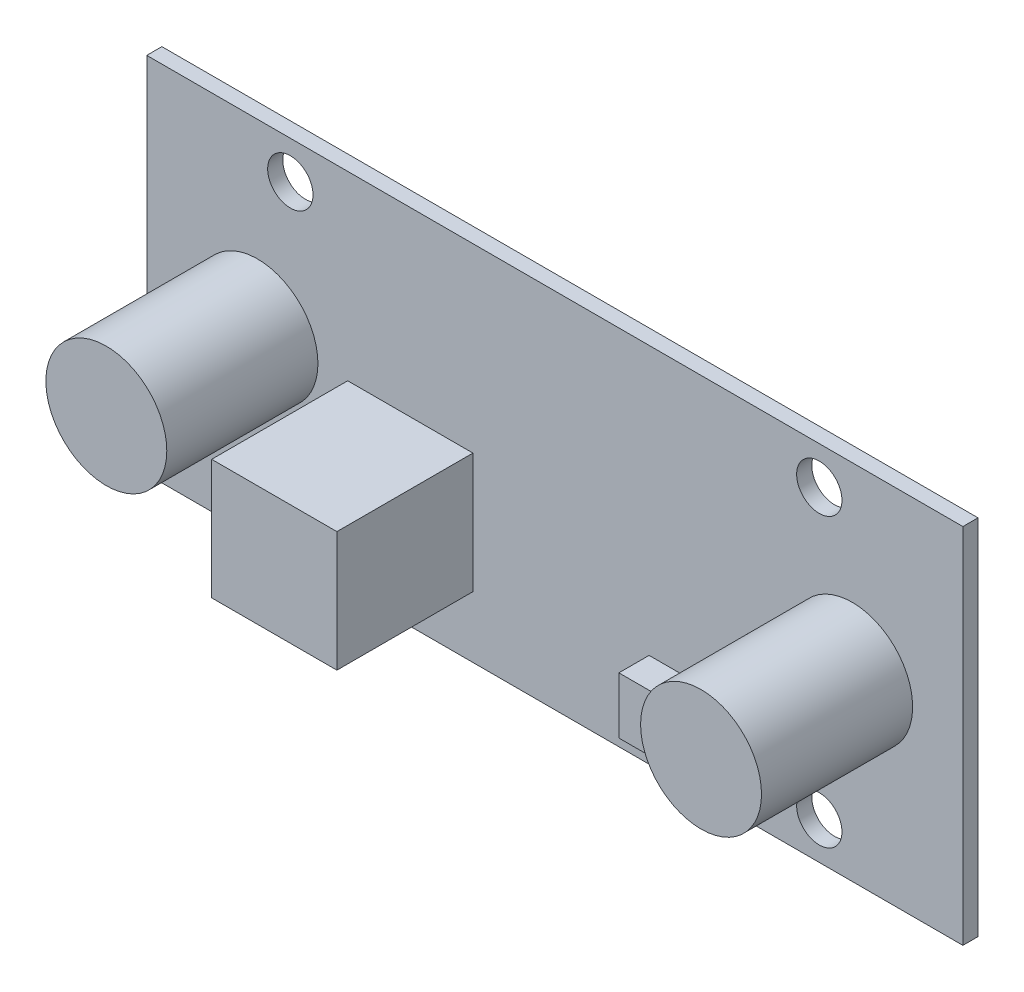
ISO-10303-21;
HEADER;
FILE_DESCRIPTION(('STEP AP214'),'2;1');
FILE_NAME('part.step','',(''),(''),'','','');
FILE_SCHEMA(('AUTOMOTIVE_DESIGN { 1 0 10303 214 1 1 1 1 }'));
ENDSEC;
DATA;
#1=APPLICATION_CONTEXT('core data for automotive mechanical design processes');
#2=APPLICATION_PROTOCOL_DEFINITION('international standard','automotive_design',2000,#1);
#3=PRODUCT_CONTEXT('',#1,'mechanical');
#4=PRODUCT('Part','Part','',(#3));
#5=PRODUCT_RELATED_PRODUCT_CATEGORY('part','',(#4));
#6=PRODUCT_DEFINITION_FORMATION('','',#4);
#7=PRODUCT_DEFINITION_CONTEXT('part definition',#1,'design');
#8=PRODUCT_DEFINITION('design','',#6,#7);
#9=PRODUCT_DEFINITION_SHAPE('','',#8);
#10=(LENGTH_UNIT() NAMED_UNIT(*) SI_UNIT(.MILLI.,.METRE.));
#11=(NAMED_UNIT(*) PLANE_ANGLE_UNIT() SI_UNIT($,.RADIAN.));
#12=(NAMED_UNIT(*) SI_UNIT($,.STERADIAN.) SOLID_ANGLE_UNIT());
#13=UNCERTAINTY_MEASURE_WITH_UNIT(LENGTH_MEASURE(1.E-05),#10,'distance_accuracy_value','');
#14=(GEOMETRIC_REPRESENTATION_CONTEXT(3) GLOBAL_UNCERTAINTY_ASSIGNED_CONTEXT((#13)) GLOBAL_UNIT_ASSIGNED_CONTEXT((#10,
#11,#12)) REPRESENTATION_CONTEXT('',''));
#15=CARTESIAN_POINT('',(0.,0.,0.));
#16=DIRECTION('',(0.,0.,1.));
#17=DIRECTION('',(1.,0.,0.));
#18=AXIS2_PLACEMENT_3D('',#15,#16,#17);
#19=CARTESIAN_POINT('',(0.,0.,1.));
#20=DIRECTION('',(0.,0.,-1.));
#21=DIRECTION('',(-1.,0.,0.));
#22=AXIS2_PLACEMENT_3D('',#19,#20,#21);
#23=PLANE('',#22);
#24=CARTESIAN_POINT('',(46.6749933578082,12.,1.));
#25=DIRECTION('',(0.,0.,1.));
#26=DIRECTION('',(-1.,0.,0.));
#27=AXIS2_PLACEMENT_3D('',#24,#25,#26);
#28=CIRCLE('',#27,4.00000000000001);
#29=CARTESIAN_POINT('',(42.6749933578082,12.,1.));
#30=VERTEX_POINT('',#29);
#31=EDGE_CURVE('E197',#30,#30,#28,.T.);
#32=ORIENTED_EDGE('',*,*,#31,.F.);
#33=EDGE_LOOP('',(#32));
#34=FACE_BOUND('',#33,.T.);
#35=CARTESIAN_POINT('',(7.32500664219177,12.,1.));
#36=DIRECTION('',(0.,0.,1.));
#37=DIRECTION('',(1.,0.,0.));
#38=AXIS2_PLACEMENT_3D('',#35,#36,#37);
#39=CIRCLE('',#38,4.);
#40=CARTESIAN_POINT('',(11.3250066421918,12.,1.));
#41=VERTEX_POINT('',#40);
#42=EDGE_CURVE('E200',#41,#41,#39,.T.);
#43=ORIENTED_EDGE('',*,*,#42,.F.);
#44=EDGE_LOOP('',(#43));
#45=FACE_BOUND('',#44,.T.);
#46=CARTESIAN_POINT('',(44.5,21.5,1.));
#47=DIRECTION('',(0.,0.,1.));
#48=DIRECTION('',(-1.,0.,0.));
#49=AXIS2_PLACEMENT_3D('',#46,#47,#48);
#50=CIRCLE('',#49,1.5);
#51=CARTESIAN_POINT('',(43.,21.5,1.));
#52=VERTEX_POINT('',#51);
#53=EDGE_CURVE('E204',#52,#52,#50,.T.);
#54=ORIENTED_EDGE('',*,*,#53,.F.);
#55=EDGE_LOOP('',(#54));
#56=FACE_BOUND('',#55,.T.);
#57=CARTESIAN_POINT('',(44.5,2.5,1.));
#58=DIRECTION('',(0.,0.,1.));
#59=DIRECTION('',(-1.,0.,0.));
#60=AXIS2_PLACEMENT_3D('',#57,#58,#59);
#61=CIRCLE('',#60,1.5);
#62=CARTESIAN_POINT('',(43.,2.5,1.));
#63=VERTEX_POINT('',#62);
#64=EDGE_CURVE('E210',#63,#63,#61,.T.);
#65=ORIENTED_EDGE('',*,*,#64,.F.);
#66=EDGE_LOOP('',(#65));
#67=FACE_BOUND('',#66,.T.);
#68=CARTESIAN_POINT('',(9.5,2.5,1.));
#69=DIRECTION('',(0.,0.,1.));
#70=DIRECTION('',(1.,0.,0.));
#71=AXIS2_PLACEMENT_3D('',#68,#69,#70);
#72=CIRCLE('',#71,1.5);
#73=CARTESIAN_POINT('',(11.,2.5,1.));
#74=VERTEX_POINT('',#73);
#75=EDGE_CURVE('E216',#74,#74,#72,.T.);
#76=ORIENTED_EDGE('',*,*,#75,.F.);
#77=EDGE_LOOP('',(#76));
#78=FACE_BOUND('',#77,.T.);
#79=CARTESIAN_POINT('',(9.5,21.5,1.));
#80=DIRECTION('',(0.,0.,1.));
#81=DIRECTION('',(1.,0.,0.));
#82=AXIS2_PLACEMENT_3D('',#79,#80,#81);
#83=CIRCLE('',#82,1.5);
#84=CARTESIAN_POINT('',(11.,21.5,1.));
#85=VERTEX_POINT('',#84);
#86=EDGE_CURVE('E222',#85,#85,#83,.T.);
#87=ORIENTED_EDGE('',*,*,#86,.F.);
#88=EDGE_LOOP('',(#87));
#89=FACE_BOUND('',#88,.T.);
#90=DIRECTION('',(0.,-1.,0.));
#91=VECTOR('',#90,1.);
#92=CARTESIAN_POINT('',(33.2378520436596,6.23616003888983,1.));
#93=LINE('',#92,#91);
#94=CARTESIAN_POINT('',(33.2378520436596,6.23616003888983,1.));
#95=VERTEX_POINT('',#94);
#96=CARTESIAN_POINT('',(33.2378520436596,2.5,1.));
#97=VERTEX_POINT('',#96);
#98=EDGE_CURVE('E225',#95,#97,#93,.T.);
#99=ORIENTED_EDGE('',*,*,#98,.F.);
#100=DIRECTION('',(-1.,0.,0.));
#101=VECTOR('',#100,1.);
#102=CARTESIAN_POINT('',(33.2378520436596,6.23616003888983,1.));
#103=LINE('',#102,#101);
#104=CARTESIAN_POINT('',(39.9091808055552,6.23616003888983,1.));
#105=VERTEX_POINT('',#104);
#106=EDGE_CURVE('E62',#105,#95,#103,.T.);
#107=ORIENTED_EDGE('',*,*,#106,.F.);
#108=DIRECTION('',(0.,1.,0.));
#109=VECTOR('',#108,1.);
#110=CARTESIAN_POINT('',(39.9091808055552,6.23616003888983,1.));
#111=LINE('',#110,#109);
#112=CARTESIAN_POINT('',(39.9091808055552,2.5,1.));
#113=VERTEX_POINT('',#112);
#114=EDGE_CURVE('E133',#113,#105,#111,.T.);
#115=ORIENTED_EDGE('',*,*,#114,.F.);
#116=DIRECTION('',(1.,0.,0.));
#117=VECTOR('',#116,1.);
#118=CARTESIAN_POINT('',(33.2378520436596,2.5,1.));
#119=LINE('',#118,#117);
#120=EDGE_CURVE('E230',#97,#113,#119,.T.);
#121=ORIENTED_EDGE('',*,*,#120,.F.);
#122=EDGE_LOOP('',(#99,#107,#115,#121));
#123=FACE_BOUND('',#122,.T.);
#124=DIRECTION('',(0.,-1.,0.));
#125=VECTOR('',#124,1.);
#126=CARTESIAN_POINT('',(0.,0.,1.));
#127=LINE('',#126,#125);
#128=CARTESIAN_POINT('',(0.,24.,1.));
#129=VERTEX_POINT('',#128);
#130=CARTESIAN_POINT('',(0.,0.,1.));
#131=VERTEX_POINT('',#130);
#132=EDGE_CURVE('E236',#129,#131,#127,.T.);
#133=ORIENTED_EDGE('',*,*,#132,.T.);
#134=DIRECTION('',(1.,0.,0.));
#135=VECTOR('',#134,1.);
#136=CARTESIAN_POINT('',(0.,0.,1.));
#137=LINE('',#136,#135);
#138=CARTESIAN_POINT('',(54.,0.,1.));
#139=VERTEX_POINT('',#138);
#140=EDGE_CURVE('E239',#131,#139,#137,.T.);
#141=ORIENTED_EDGE('',*,*,#140,.T.);
#142=DIRECTION('',(0.,1.,0.));
#143=VECTOR('',#142,1.);
#144=CARTESIAN_POINT('',(54.,0.,1.));
#145=LINE('',#144,#143);
#146=CARTESIAN_POINT('',(54.,24.,1.));
#147=VERTEX_POINT('',#146);
#148=EDGE_CURVE('E242',#139,#147,#145,.T.);
#149=ORIENTED_EDGE('',*,*,#148,.T.);
#150=DIRECTION('',(-1.,0.,0.));
#151=VECTOR('',#150,1.);
#152=CARTESIAN_POINT('',(0.,24.,1.));
#153=LINE('',#152,#151);
#154=EDGE_CURVE('E244',#147,#129,#153,.T.);
#155=ORIENTED_EDGE('',*,*,#154,.T.);
#156=EDGE_LOOP('',(#133,#141,#149,#155));
#157=FACE_BOUND('',#156,.T.);
#158=DIRECTION('',(0.,-1.,0.));
#159=VECTOR('',#158,1.);
#160=CARTESIAN_POINT('',(13.2940902712562,12.,1.));
#161=LINE('',#160,#159);
#162=CARTESIAN_POINT('',(13.2940902712562,12.,1.));
#163=VERTEX_POINT('',#162);
#164=CARTESIAN_POINT('',(13.2940902712562,4.05920012711339,1.));
#165=VERTEX_POINT('',#164);
#166=EDGE_CURVE('E188',#163,#165,#161,.T.);
#167=ORIENTED_EDGE('',*,*,#166,.F.);
#168=DIRECTION('',(-1.,0.,0.));
#169=VECTOR('',#168,1.);
#170=CARTESIAN_POINT('',(13.2940902712562,12.,1.));
#171=LINE('',#170,#169);
#172=CARTESIAN_POINT('',(21.5805828386633,12.,1.));
#173=VERTEX_POINT('',#172);
#174=EDGE_CURVE('E54',#173,#163,#171,.T.);
#175=ORIENTED_EDGE('',*,*,#174,.F.);
#176=DIRECTION('',(0.,1.,0.));
#177=VECTOR('',#176,1.);
#178=CARTESIAN_POINT('',(21.5805828386633,12.,1.));
#179=LINE('',#178,#177);
#180=CARTESIAN_POINT('',(21.5805828386633,4.05920012711339,0.999999999999999));
#181=VERTEX_POINT('',#180);
#182=EDGE_CURVE('E194',#181,#173,#179,.T.);
#183=ORIENTED_EDGE('',*,*,#182,.F.);
#184=DIRECTION('',(1.,0.,0.));
#185=VECTOR('',#184,1.);
#186=CARTESIAN_POINT('',(13.2940902712562,4.05920012711339,1.));
#187=LINE('',#186,#185);
#188=EDGE_CURVE('E191',#165,#181,#187,.T.);
#189=ORIENTED_EDGE('',*,*,#188,.F.);
#190=EDGE_LOOP('',(#167,#175,#183,#189));
#191=FACE_BOUND('',#190,.T.);
#192=ADVANCED_FACE('F39',(#34,#45,#56,#67,#78,#89,#123,#157,#191),#23,.F.);
#193=CARTESIAN_POINT('',(0.,0.,0.));
#194=DIRECTION('',(0.,0.,-1.));
#195=DIRECTION('',(-1.,0.,0.));
#196=AXIS2_PLACEMENT_3D('',#193,#194,#195);
#197=PLANE('',#196);
#198=CARTESIAN_POINT('',(44.5,2.5,0.));
#199=DIRECTION('',(0.,0.,1.));
#200=DIRECTION('',(-1.,0.,0.));
#201=AXIS2_PLACEMENT_3D('',#198,#199,#200);
#202=CIRCLE('',#201,1.5);
#203=CARTESIAN_POINT('',(43.,2.5,0.));
#204=VERTEX_POINT('',#203);
#205=EDGE_CURVE('E207',#204,#204,#202,.T.);
#206=ORIENTED_EDGE('',*,*,#205,.T.);
#207=EDGE_LOOP('',(#206));
#208=FACE_BOUND('',#207,.T.);
#209=CARTESIAN_POINT('',(9.5,21.5,0.));
#210=DIRECTION('',(0.,0.,1.));
#211=DIRECTION('',(1.,0.,0.));
#212=AXIS2_PLACEMENT_3D('',#209,#210,#211);
#213=CIRCLE('',#212,1.5);
#214=CARTESIAN_POINT('',(11.,21.5,0.));
#215=VERTEX_POINT('',#214);
#216=EDGE_CURVE('E219',#215,#215,#213,.T.);
#217=ORIENTED_EDGE('',*,*,#216,.T.);
#218=EDGE_LOOP('',(#217));
#219=FACE_BOUND('',#218,.T.);
#220=DIRECTION('',(0.,-1.,0.));
#221=VECTOR('',#220,1.);
#222=CARTESIAN_POINT('',(0.,0.,0.));
#223=LINE('',#222,#221);
#224=CARTESIAN_POINT('',(0.,24.,0.));
#225=VERTEX_POINT('',#224);
#226=CARTESIAN_POINT('',(0.,0.,0.));
#227=VERTEX_POINT('',#226);
#228=EDGE_CURVE('E235',#225,#227,#223,.T.);
#229=ORIENTED_EDGE('',*,*,#228,.F.);
#230=DIRECTION('',(-1.,0.,0.));
#231=VECTOR('',#230,1.);
#232=CARTESIAN_POINT('',(0.,24.,0.));
#233=LINE('',#232,#231);
#234=CARTESIAN_POINT('',(54.,24.,0.));
#235=VERTEX_POINT('',#234);
#236=EDGE_CURVE('E240',#235,#225,#233,.T.);
#237=ORIENTED_EDGE('',*,*,#236,.F.);
#238=DIRECTION('',(0.,1.,0.));
#239=VECTOR('',#238,1.);
#240=CARTESIAN_POINT('',(54.,0.,0.));
#241=LINE('',#240,#239);
#242=CARTESIAN_POINT('',(54.,0.,0.));
#243=VERTEX_POINT('',#242);
#244=EDGE_CURVE('E251',#243,#235,#241,.T.);
#245=ORIENTED_EDGE('',*,*,#244,.F.);
#246=DIRECTION('',(1.,0.,0.));
#247=VECTOR('',#246,1.);
#248=CARTESIAN_POINT('',(0.,0.,0.));
#249=LINE('',#248,#247);
#250=EDGE_CURVE('E249',#227,#243,#249,.T.);
#251=ORIENTED_EDGE('',*,*,#250,.F.);
#252=EDGE_LOOP('',(#229,#237,#245,#251));
#253=FACE_BOUND('',#252,.T.);
#254=CARTESIAN_POINT('',(9.5,2.5,0.));
#255=DIRECTION('',(0.,0.,1.));
#256=DIRECTION('',(1.,0.,0.));
#257=AXIS2_PLACEMENT_3D('',#254,#255,#256);
#258=CIRCLE('',#257,1.5);
#259=CARTESIAN_POINT('',(11.,2.5,0.));
#260=VERTEX_POINT('',#259);
#261=EDGE_CURVE('E213',#260,#260,#258,.T.);
#262=ORIENTED_EDGE('',*,*,#261,.T.);
#263=EDGE_LOOP('',(#262));
#264=FACE_BOUND('',#263,.T.);
#265=CARTESIAN_POINT('',(44.5,21.5,0.));
#266=DIRECTION('',(0.,0.,1.));
#267=DIRECTION('',(-1.,0.,0.));
#268=AXIS2_PLACEMENT_3D('',#265,#266,#267);
#269=CIRCLE('',#268,1.5);
#270=CARTESIAN_POINT('',(43.,21.5,0.));
#271=VERTEX_POINT('',#270);
#272=EDGE_CURVE('E203',#271,#271,#269,.T.);
#273=ORIENTED_EDGE('',*,*,#272,.T.);
#274=EDGE_LOOP('',(#273));
#275=FACE_BOUND('',#274,.T.);
#276=ADVANCED_FACE('F269',(#208,#219,#253,#264,#275),#197,.T.);
#277=CARTESIAN_POINT('',(0.,0.,1.));
#278=DIRECTION('',(1.,0.,0.));
#279=DIRECTION('',(0.,0.,-1.));
#280=AXIS2_PLACEMENT_3D('',#277,#278,#279);
#281=PLANE('',#280);
#282=ORIENTED_EDGE('',*,*,#228,.T.);
#283=DIRECTION('',(0.,0.,-1.));
#284=VECTOR('',#283,1.);
#285=CARTESIAN_POINT('',(0.,0.,1.));
#286=LINE('',#285,#284);
#287=EDGE_CURVE('E11',#131,#227,#286,.T.);
#288=ORIENTED_EDGE('',*,*,#287,.F.);
#289=ORIENTED_EDGE('',*,*,#132,.F.);
#290=DIRECTION('',(0.,0.,-1.));
#291=VECTOR('',#290,1.);
#292=CARTESIAN_POINT('',(0.,24.,1.));
#293=LINE('',#292,#291);
#294=EDGE_CURVE('E246',#129,#225,#293,.T.);
#295=ORIENTED_EDGE('',*,*,#294,.T.);
#296=EDGE_LOOP('',(#282,#288,#289,#295));
#297=FACE_BOUND('',#296,.T.);
#298=ADVANCED_FACE('F41',(#297),#281,.F.);
#299=CARTESIAN_POINT('',(0.,0.,1.));
#300=DIRECTION('',(0.,1.,0.));
#301=DIRECTION('',(0.,0.,1.));
#302=AXIS2_PLACEMENT_3D('',#299,#300,#301);
#303=PLANE('',#302);
#304=ORIENTED_EDGE('',*,*,#250,.T.);
#305=DIRECTION('',(0.,0.,-1.));
#306=VECTOR('',#305,1.);
#307=CARTESIAN_POINT('',(54.,0.,1.));
#308=LINE('',#307,#306);
#309=EDGE_CURVE('E47',#139,#243,#308,.T.);
#310=ORIENTED_EDGE('',*,*,#309,.F.);
#311=ORIENTED_EDGE('',*,*,#140,.F.);
#312=ORIENTED_EDGE('',*,*,#287,.T.);
#313=EDGE_LOOP('',(#304,#310,#311,#312));
#314=FACE_BOUND('',#313,.T.);
#315=ADVANCED_FACE('F279',(#314),#303,.F.);
#316=CARTESIAN_POINT('',(54.,0.,1.));
#317=DIRECTION('',(-1.,0.,0.));
#318=DIRECTION('',(0.,0.,1.));
#319=AXIS2_PLACEMENT_3D('',#316,#317,#318);
#320=PLANE('',#319);
#321=ORIENTED_EDGE('',*,*,#244,.T.);
#322=DIRECTION('',(0.,0.,-1.));
#323=VECTOR('',#322,1.);
#324=CARTESIAN_POINT('',(54.,24.,1.));
#325=LINE('',#324,#323);
#326=EDGE_CURVE('E256',#147,#235,#325,.T.);
#327=ORIENTED_EDGE('',*,*,#326,.F.);
#328=ORIENTED_EDGE('',*,*,#148,.F.);
#329=ORIENTED_EDGE('',*,*,#309,.T.);
#330=EDGE_LOOP('',(#321,#327,#328,#329));
#331=FACE_BOUND('',#330,.T.);
#332=ADVANCED_FACE('F263',(#331),#320,.F.);
#333=CARTESIAN_POINT('',(0.,24.,1.));
#334=DIRECTION('',(0.,-1.,0.));
#335=DIRECTION('',(0.,0.,-1.));
#336=AXIS2_PLACEMENT_3D('',#333,#334,#335);
#337=PLANE('',#336);
#338=ORIENTED_EDGE('',*,*,#236,.T.);
#339=ORIENTED_EDGE('',*,*,#294,.F.);
#340=ORIENTED_EDGE('',*,*,#154,.F.);
#341=ORIENTED_EDGE('',*,*,#326,.T.);
#342=EDGE_LOOP('',(#338,#339,#340,#341));
#343=FACE_BOUND('',#342,.T.);
#344=ADVANCED_FACE('F273',(#343),#337,.F.);
#345=CARTESIAN_POINT('',(9.5,21.5,1.));
#346=DIRECTION('',(0.,0.,-1.));
#347=DIRECTION('',(-1.,0.,0.));
#348=AXIS2_PLACEMENT_3D('',#345,#346,#347);
#349=CYLINDRICAL_SURFACE('',#348,1.5);
#350=ORIENTED_EDGE('',*,*,#86,.T.);
#351=EDGE_LOOP('',(#350));
#352=FACE_BOUND('',#351,.T.);
#353=ORIENTED_EDGE('',*,*,#216,.F.);
#354=EDGE_LOOP('',(#353));
#355=FACE_BOUND('',#354,.T.);
#356=ADVANCED_FACE('F297',(#352,#355),#349,.F.);
#357=CARTESIAN_POINT('',(9.5,2.5,1.));
#358=DIRECTION('',(0.,0.,-1.));
#359=DIRECTION('',(-1.,0.,0.));
#360=AXIS2_PLACEMENT_3D('',#357,#358,#359);
#361=CYLINDRICAL_SURFACE('',#360,1.5);
#362=ORIENTED_EDGE('',*,*,#75,.T.);
#363=EDGE_LOOP('',(#362));
#364=FACE_BOUND('',#363,.T.);
#365=ORIENTED_EDGE('',*,*,#261,.F.);
#366=EDGE_LOOP('',(#365));
#367=FACE_BOUND('',#366,.T.);
#368=ADVANCED_FACE('F304',(#364,#367),#361,.F.);
#369=CARTESIAN_POINT('',(44.5,2.5,1.));
#370=DIRECTION('',(0.,0.,-1.));
#371=DIRECTION('',(-1.,0.,0.));
#372=AXIS2_PLACEMENT_3D('',#369,#370,#371);
#373=CYLINDRICAL_SURFACE('',#372,1.5);
#374=ORIENTED_EDGE('',*,*,#64,.T.);
#375=EDGE_LOOP('',(#374));
#376=FACE_BOUND('',#375,.T.);
#377=ORIENTED_EDGE('',*,*,#205,.F.);
#378=EDGE_LOOP('',(#377));
#379=FACE_BOUND('',#378,.T.);
#380=ADVANCED_FACE('F309',(#376,#379),#373,.F.);
#381=CARTESIAN_POINT('',(44.5,21.5,1.));
#382=DIRECTION('',(0.,0.,-1.));
#383=DIRECTION('',(-1.,0.,0.));
#384=AXIS2_PLACEMENT_3D('',#381,#382,#383);
#385=CYLINDRICAL_SURFACE('',#384,1.5);
#386=ORIENTED_EDGE('',*,*,#53,.T.);
#387=EDGE_LOOP('',(#386));
#388=FACE_BOUND('',#387,.T.);
#389=ORIENTED_EDGE('',*,*,#272,.F.);
#390=EDGE_LOOP('',(#389));
#391=FACE_BOUND('',#390,.T.);
#392=ADVANCED_FACE('F368',(#388,#391),#385,.F.);
#393=CARTESIAN_POINT('',(7.32500664219177,12.,11.));
#394=DIRECTION('',(0.,0.,-1.));
#395=DIRECTION('',(-1.,0.,0.));
#396=AXIS2_PLACEMENT_3D('',#393,#394,#395);
#397=CYLINDRICAL_SURFACE('',#396,4.);
#398=CARTESIAN_POINT('',(7.32500664219177,12.,11.));
#399=DIRECTION('',(0.,0.,1.));
#400=DIRECTION('',(1.,0.,0.));
#401=AXIS2_PLACEMENT_3D('',#398,#399,#400);
#402=CIRCLE('',#401,4.);
#403=CARTESIAN_POINT('',(11.3250066421918,12.,11.));
#404=VERTEX_POINT('',#403);
#405=EDGE_CURVE('E185',#404,#404,#402,.T.);
#406=ORIENTED_EDGE('',*,*,#405,.F.);
#407=EDGE_LOOP('',(#406));
#408=FACE_BOUND('',#407,.T.);
#409=ORIENTED_EDGE('',*,*,#42,.T.);
#410=EDGE_LOOP('',(#409));
#411=FACE_BOUND('',#410,.T.);
#412=ADVANCED_FACE('F364',(#408,#411),#397,.T.);
#413=CARTESIAN_POINT('',(0.,0.,11.));
#414=DIRECTION('',(0.,0.,1.));
#415=DIRECTION('',(1.,0.,0.));
#416=AXIS2_PLACEMENT_3D('',#413,#414,#415);
#417=PLANE('',#416);
#418=ORIENTED_EDGE('',*,*,#405,.T.);
#419=EDGE_LOOP('',(#418));
#420=FACE_BOUND('',#419,.T.);
#421=ADVANCED_FACE('F360',(#420),#417,.T.);
#422=CARTESIAN_POINT('',(46.6749933578082,12.,11.));
#423=DIRECTION('',(0.,0.,-1.));
#424=DIRECTION('',(-1.,0.,0.));
#425=AXIS2_PLACEMENT_3D('',#422,#423,#424);
#426=CYLINDRICAL_SURFACE('',#425,4.00000000000001);
#427=CARTESIAN_POINT('',(46.6749933578082,12.,11.));
#428=DIRECTION('',(0.,0.,1.));
#429=DIRECTION('',(1.,0.,0.));
#430=AXIS2_PLACEMENT_3D('',#427,#428,#429);
#431=CIRCLE('',#430,4.00000000000001);
#432=CARTESIAN_POINT('',(50.6749933578082,12.,11.));
#433=VERTEX_POINT('',#432);
#434=EDGE_CURVE('E182',#433,#433,#431,.F.);
#435=ORIENTED_EDGE('',*,*,#434,.T.);
#436=EDGE_LOOP('',(#435));
#437=FACE_BOUND('',#436,.T.);
#438=ORIENTED_EDGE('',*,*,#31,.T.);
#439=EDGE_LOOP('',(#438));
#440=FACE_BOUND('',#439,.T.);
#441=ADVANCED_FACE('F356',(#437,#440),#426,.T.);
#442=CARTESIAN_POINT('',(0.,0.,11.));
#443=DIRECTION('',(0.,0.,1.));
#444=DIRECTION('',(1.,0.,0.));
#445=AXIS2_PLACEMENT_3D('',#442,#443,#444);
#446=PLANE('',#445);
#447=ORIENTED_EDGE('',*,*,#434,.F.);
#448=EDGE_LOOP('',(#447));
#449=FACE_BOUND('',#448,.T.);
#450=ADVANCED_FACE('F349',(#449),#446,.T.);
#451=CARTESIAN_POINT('',(0.,12.,10.));
#452=DIRECTION('',(0.,1.,0.));
#453=DIRECTION('',(0.,0.,1.));
#454=AXIS2_PLACEMENT_3D('',#451,#452,#453);
#455=PLANE('',#454);
#456=ORIENTED_EDGE('',*,*,#174,.T.);
#457=DIRECTION('',(0.,0.,-1.));
#458=VECTOR('',#457,1.);
#459=CARTESIAN_POINT('',(13.2940902712562,12.,10.));
#460=LINE('',#459,#458);
#461=CARTESIAN_POINT('',(13.2940902712562,12.,10.));
#462=VERTEX_POINT('',#461);
#463=EDGE_CURVE('E176',#462,#163,#460,.T.);
#464=ORIENTED_EDGE('',*,*,#463,.F.);
#465=DIRECTION('',(1.,0.,0.));
#466=VECTOR('',#465,1.);
#467=CARTESIAN_POINT('',(0.,12.,10.));
#468=LINE('',#467,#466);
#469=CARTESIAN_POINT('',(21.5805828386633,12.,10.));
#470=VERTEX_POINT('',#469);
#471=EDGE_CURVE('E163',#462,#470,#468,.T.);
#472=ORIENTED_EDGE('',*,*,#471,.T.);
#473=DIRECTION('',(0.,0.,-1.));
#474=VECTOR('',#473,1.);
#475=CARTESIAN_POINT('',(21.5805828386633,12.,10.));
#476=LINE('',#475,#474);
#477=EDGE_CURVE('E179',#470,#173,#476,.T.);
#478=ORIENTED_EDGE('',*,*,#477,.T.);
#479=EDGE_LOOP('',(#456,#464,#472,#478));
#480=FACE_BOUND('',#479,.T.);
#481=ADVANCED_FACE('F342',(#480),#455,.T.);
#482=CARTESIAN_POINT('',(0.,4.05920012711339,10.));
#483=DIRECTION('',(0.,1.,0.));
#484=DIRECTION('',(0.,0.,1.));
#485=AXIS2_PLACEMENT_3D('',#482,#483,#484);
#486=PLANE('',#485);
#487=DIRECTION('',(0.,0.,-1.));
#488=VECTOR('',#487,1.);
#489=CARTESIAN_POINT('',(13.2940902712562,4.05920012711339,10.));
#490=LINE('',#489,#488);
#491=CARTESIAN_POINT('',(13.2940902712562,4.05920012711339,10.));
#492=VERTEX_POINT('',#491);
#493=EDGE_CURVE('E173',#492,#165,#490,.T.);
#494=ORIENTED_EDGE('',*,*,#493,.T.);
#495=ORIENTED_EDGE('',*,*,#188,.T.);
#496=DIRECTION('',(0.,0.,-1.));
#497=VECTOR('',#496,1.);
#498=CARTESIAN_POINT('',(21.5805828386633,4.05920012711339,10.));
#499=LINE('',#498,#497);
#500=CARTESIAN_POINT('',(21.5805828386633,4.05920012711339,10.));
#501=VERTEX_POINT('',#500);
#502=EDGE_CURVE('E170',#501,#181,#499,.T.);
#503=ORIENTED_EDGE('',*,*,#502,.F.);
#504=DIRECTION('',(1.,0.,0.));
#505=VECTOR('',#504,1.);
#506=CARTESIAN_POINT('',(0.,4.05920012711339,10.));
#507=LINE('',#506,#505);
#508=EDGE_CURVE('E168',#492,#501,#507,.T.);
#509=ORIENTED_EDGE('',*,*,#508,.F.);
#510=EDGE_LOOP('',(#494,#495,#503,#509));
#511=FACE_BOUND('',#510,.T.);
#512=ADVANCED_FACE('F338',(#511),#486,.F.);
#513=CARTESIAN_POINT('',(21.5805828386633,0.,10.));
#514=DIRECTION('',(1.,0.,0.));
#515=DIRECTION('',(0.,0.,-1.));
#516=AXIS2_PLACEMENT_3D('',#513,#514,#515);
#517=PLANE('',#516);
#518=ORIENTED_EDGE('',*,*,#182,.T.);
#519=ORIENTED_EDGE('',*,*,#477,.F.);
#520=DIRECTION('',(0.,-1.,0.));
#521=VECTOR('',#520,1.);
#522=CARTESIAN_POINT('',(21.5805828386633,0.,10.));
#523=LINE('',#522,#521);
#524=EDGE_CURVE('E136',#470,#501,#523,.T.);
#525=ORIENTED_EDGE('',*,*,#524,.T.);
#526=ORIENTED_EDGE('',*,*,#502,.T.);
#527=EDGE_LOOP('',(#518,#519,#525,#526));
#528=FACE_BOUND('',#527,.T.);
#529=ADVANCED_FACE('F341',(#528),#517,.T.);
#530=CARTESIAN_POINT('',(13.2940902712562,0.,10.));
#531=DIRECTION('',(1.,0.,0.));
#532=DIRECTION('',(0.,0.,-1.));
#533=AXIS2_PLACEMENT_3D('',#530,#531,#532);
#534=PLANE('',#533);
#535=ORIENTED_EDGE('',*,*,#463,.T.);
#536=ORIENTED_EDGE('',*,*,#166,.T.);
#537=ORIENTED_EDGE('',*,*,#493,.F.);
#538=DIRECTION('',(0.,-1.,0.));
#539=VECTOR('',#538,1.);
#540=CARTESIAN_POINT('',(13.2940902712562,0.,10.));
#541=LINE('',#540,#539);
#542=EDGE_CURVE('E166',#462,#492,#541,.T.);
#543=ORIENTED_EDGE('',*,*,#542,.F.);
#544=EDGE_LOOP('',(#535,#536,#537,#543));
#545=FACE_BOUND('',#544,.T.);
#546=ADVANCED_FACE('F336',(#545),#534,.F.);
#547=CARTESIAN_POINT('',(0.,0.,10.));
#548=DIRECTION('',(0.,0.,1.));
#549=DIRECTION('',(1.,0.,0.));
#550=AXIS2_PLACEMENT_3D('',#547,#548,#549);
#551=PLANE('',#550);
#552=ORIENTED_EDGE('',*,*,#524,.F.);
#553=ORIENTED_EDGE('',*,*,#471,.F.);
#554=ORIENTED_EDGE('',*,*,#542,.T.);
#555=ORIENTED_EDGE('',*,*,#508,.T.);
#556=EDGE_LOOP('',(#552,#553,#554,#555));
#557=FACE_BOUND('',#556,.T.);
#558=ADVANCED_FACE('F328',(#557),#551,.T.);
#559=CARTESIAN_POINT('',(0.,6.23616003888983,3.));
#560=DIRECTION('',(0.,1.,0.));
#561=DIRECTION('',(0.,0.,1.));
#562=AXIS2_PLACEMENT_3D('',#559,#560,#561);
#563=PLANE('',#562);
#564=ORIENTED_EDGE('',*,*,#106,.T.);
#565=DIRECTION('',(0.,0.,-1.));
#566=VECTOR('',#565,1.);
#567=CARTESIAN_POINT('',(33.2378520436596,6.23616003888983,3.));
#568=LINE('',#567,#566);
#569=CARTESIAN_POINT('',(33.2378520436596,6.23616003888983,3.));
#570=VERTEX_POINT('',#569);
#571=EDGE_CURVE('E137',#570,#95,#568,.T.);
#572=ORIENTED_EDGE('',*,*,#571,.F.);
#573=DIRECTION('',(1.,0.,0.));
#574=VECTOR('',#573,1.);
#575=CARTESIAN_POINT('',(0.,6.23616003888983,3.));
#576=LINE('',#575,#574);
#577=CARTESIAN_POINT('',(39.9091808055552,6.23616003888983,3.));
#578=VERTEX_POINT('',#577);
#579=EDGE_CURVE('E142',#570,#578,#576,.T.);
#580=ORIENTED_EDGE('',*,*,#579,.T.);
#581=DIRECTION('',(0.,0.,-1.));
#582=VECTOR('',#581,1.);
#583=CARTESIAN_POINT('',(39.9091808055552,6.23616003888983,3.));
#584=LINE('',#583,#582);
#585=EDGE_CURVE('E128',#578,#105,#584,.T.);
#586=ORIENTED_EDGE('',*,*,#585,.T.);
#587=EDGE_LOOP('',(#564,#572,#580,#586));
#588=FACE_BOUND('',#587,.T.);
#589=ADVANCED_FACE('F147',(#588),#563,.T.);
#590=CARTESIAN_POINT('',(0.,2.5,3.));
#591=DIRECTION('',(0.,1.,0.));
#592=DIRECTION('',(0.,0.,1.));
#593=AXIS2_PLACEMENT_3D('',#590,#591,#592);
#594=PLANE('',#593);
#595=DIRECTION('',(0.,0.,-1.));
#596=VECTOR('',#595,1.);
#597=CARTESIAN_POINT('',(33.2378520436596,2.5,3.));
#598=LINE('',#597,#596);
#599=CARTESIAN_POINT('',(33.2378520436596,2.5,3.));
#600=VERTEX_POINT('',#599);
#601=EDGE_CURVE('E157',#600,#97,#598,.T.);
#602=ORIENTED_EDGE('',*,*,#601,.T.);
#603=ORIENTED_EDGE('',*,*,#120,.T.);
#604=DIRECTION('',(0.,0.,-1.));
#605=VECTOR('',#604,1.);
#606=CARTESIAN_POINT('',(39.9091808055552,2.5,3.));
#607=LINE('',#606,#605);
#608=CARTESIAN_POINT('',(39.9091808055552,2.5,3.));
#609=VERTEX_POINT('',#608);
#610=EDGE_CURVE('E155',#609,#113,#607,.T.);
#611=ORIENTED_EDGE('',*,*,#610,.F.);
#612=DIRECTION('',(1.,0.,0.));
#613=VECTOR('',#612,1.);
#614=CARTESIAN_POINT('',(0.,2.5,3.));
#615=LINE('',#614,#613);
#616=EDGE_CURVE('E144',#600,#609,#615,.T.);
#617=ORIENTED_EDGE('',*,*,#616,.F.);
#618=EDGE_LOOP('',(#602,#603,#611,#617));
#619=FACE_BOUND('',#618,.T.);
#620=ADVANCED_FACE('F320',(#619),#594,.F.);
#621=CARTESIAN_POINT('',(39.9091808055552,0.,3.));
#622=DIRECTION('',(1.,0.,0.));
#623=DIRECTION('',(0.,0.,-1.));
#624=AXIS2_PLACEMENT_3D('',#621,#622,#623);
#625=PLANE('',#624);
#626=ORIENTED_EDGE('',*,*,#114,.T.);
#627=ORIENTED_EDGE('',*,*,#585,.F.);
#628=DIRECTION('',(0.,-1.,0.));
#629=VECTOR('',#628,1.);
#630=CARTESIAN_POINT('',(39.9091808055552,0.,3.));
#631=LINE('',#630,#629);
#632=EDGE_CURVE('E132',#578,#609,#631,.T.);
#633=ORIENTED_EDGE('',*,*,#632,.T.);
#634=ORIENTED_EDGE('',*,*,#610,.T.);
#635=EDGE_LOOP('',(#626,#627,#633,#634));
#636=FACE_BOUND('',#635,.T.);
#637=ADVANCED_FACE('F130',(#636),#625,.T.);
#638=CARTESIAN_POINT('',(33.2378520436596,0.,3.));
#639=DIRECTION('',(1.,0.,0.));
#640=DIRECTION('',(0.,0.,-1.));
#641=AXIS2_PLACEMENT_3D('',#638,#639,#640);
#642=PLANE('',#641);
#643=ORIENTED_EDGE('',*,*,#571,.T.);
#644=ORIENTED_EDGE('',*,*,#98,.T.);
#645=ORIENTED_EDGE('',*,*,#601,.F.);
#646=DIRECTION('',(0.,-1.,0.));
#647=VECTOR('',#646,1.);
#648=CARTESIAN_POINT('',(33.2378520436596,0.,3.));
#649=LINE('',#648,#647);
#650=EDGE_CURVE('E150',#570,#600,#649,.T.);
#651=ORIENTED_EDGE('',*,*,#650,.F.);
#652=EDGE_LOOP('',(#643,#644,#645,#651));
#653=FACE_BOUND('',#652,.T.);
#654=ADVANCED_FACE('F318',(#653),#642,.F.);
#655=CARTESIAN_POINT('',(0.,0.,3.));
#656=DIRECTION('',(0.,0.,1.));
#657=DIRECTION('',(1.,0.,0.));
#658=AXIS2_PLACEMENT_3D('',#655,#656,#657);
#659=PLANE('',#658);
#660=ORIENTED_EDGE('',*,*,#632,.F.);
#661=ORIENTED_EDGE('',*,*,#579,.F.);
#662=ORIENTED_EDGE('',*,*,#650,.T.);
#663=ORIENTED_EDGE('',*,*,#616,.T.);
#664=EDGE_LOOP('',(#660,#661,#662,#663));
#665=FACE_BOUND('',#664,.T.);
#666=ADVANCED_FACE('F141',(#665),#659,.T.);
#667=CLOSED_SHELL('',(#192,#276,#298,#315,#332,#344,#356,#368,#380,#392,#412,#421,#441,#450,
#481,#512,#529,#546,#558,#589,#620,#637,#654,#666));
#668=MANIFOLD_SOLID_BREP('B2',#667);
#669=ADVANCED_BREP_SHAPE_REPRESENTATION('',(#18,#668),#14);
#670=SHAPE_DEFINITION_REPRESENTATION(#9,#669);
ENDSEC;
END-ISO-10303-21;
